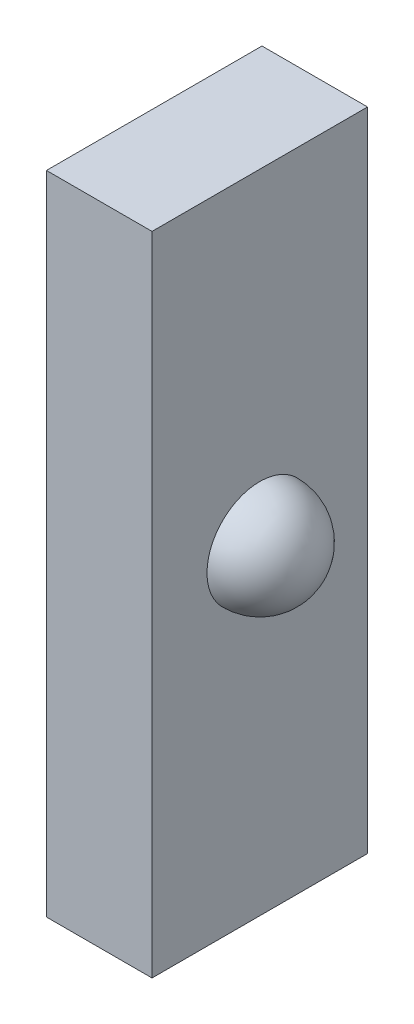
ISO-10303-21;
HEADER;
FILE_DESCRIPTION(('STEP AP214'),'2;1');
FILE_NAME('part.step','',(''),(''),'','','');
FILE_SCHEMA(('AUTOMOTIVE_DESIGN { 1 0 10303 214 1 1 1 1 }'));
ENDSEC;
DATA;
#1=APPLICATION_CONTEXT('core data for automotive mechanical design processes');
#2=APPLICATION_PROTOCOL_DEFINITION('international standard','automotive_design',2000,#1);
#3=PRODUCT_CONTEXT('',#1,'mechanical');
#4=PRODUCT('Part','Part','',(#3));
#5=PRODUCT_RELATED_PRODUCT_CATEGORY('part','',(#4));
#6=PRODUCT_DEFINITION_FORMATION('','',#4);
#7=PRODUCT_DEFINITION_CONTEXT('part definition',#1,'design');
#8=PRODUCT_DEFINITION('design','',#6,#7);
#9=PRODUCT_DEFINITION_SHAPE('','',#8);
#10=(LENGTH_UNIT() NAMED_UNIT(*) SI_UNIT(.MILLI.,.METRE.));
#11=(NAMED_UNIT(*) PLANE_ANGLE_UNIT() SI_UNIT($,.RADIAN.));
#12=(NAMED_UNIT(*) SI_UNIT($,.STERADIAN.) SOLID_ANGLE_UNIT());
#13=UNCERTAINTY_MEASURE_WITH_UNIT(LENGTH_MEASURE(1.E-05),#10,'distance_accuracy_value','');
#14=(GEOMETRIC_REPRESENTATION_CONTEXT(3) GLOBAL_UNCERTAINTY_ASSIGNED_CONTEXT((#13)) GLOBAL_UNIT_ASSIGNED_CONTEXT((#10,
#11,#12)) REPRESENTATION_CONTEXT('',''));
#15=CARTESIAN_POINT('',(0.,0.,0.));
#16=DIRECTION('',(0.,0.,1.));
#17=DIRECTION('',(1.,0.,0.));
#18=AXIS2_PLACEMENT_3D('',#15,#16,#17);
#19=CARTESIAN_POINT('',(0.,0.,0.));
#20=DIRECTION('',(0.,1.,0.));
#21=DIRECTION('',(0.,0.,1.));
#22=AXIS2_PLACEMENT_3D('',#19,#20,#21);
#23=SPHERICAL_SURFACE('',#22,4.9);
#24=CARTESIAN_POINT('',(0.,0.,0.));
#25=DIRECTION('',(-1.,0.,0.));
#26=DIRECTION('',(0.,0.,1.));
#27=AXIS2_PLACEMENT_3D('',#24,#25,#26);
#28=SPHERICAL_SURFACE('',#27,4.9);
#29=CARTESIAN_POINT('',(0.,0.,0.));
#30=DIRECTION('',(-1.,0.,0.));
#31=DIRECTION('',(0.,0.,1.));
#32=AXIS2_PLACEMENT_3D('',#29,#30,#31);
#33=CIRCLE('',#32,4.9);
#34=CARTESIAN_POINT('',(0.,0.,4.9));
#35=VERTEX_POINT('',#34);
#36=EDGE_CURVE('E11',#35,#35,#33,.T.);
#37=ORIENTED_EDGE('',*,*,#36,.F.);
#38=EDGE_LOOP('',(#37));
#39=FACE_BOUND('',#38,.T.);
#40=ADVANCED_FACE('F45',(#39),#28,.T.);
#41=CARTESIAN_POINT('',(-9.79688528222315,30.,-10.));
#42=DIRECTION('',(-1.,0.,0.));
#43=DIRECTION('',(0.,-1.,0.));
#44=AXIS2_PLACEMENT_3D('',#41,#42,#43);
#45=PLANE('',#44);
#46=CARTESIAN_POINT('',(-9.79688528222315,0.,0.));
#47=DIRECTION('',(-1.,0.,0.));
#48=DIRECTION('',(0.,-1.,0.));
#49=AXIS2_PLACEMENT_3D('',#46,#47,#48);
#50=CIRCLE('',#49,9.2);
#51=CARTESIAN_POINT('',(-9.79688528222315,9.2,0.));
#52=VERTEX_POINT('',#51);
#53=CARTESIAN_POINT('',(-9.79688528222315,-9.2,0.));
#54=VERTEX_POINT('',#53);
#55=EDGE_CURVE('E65',#52,#54,#50,.T.);
#56=ORIENTED_EDGE('',*,*,#55,.F.);
#57=CARTESIAN_POINT('',(-9.79688528222315,18.4,0.));
#58=DIRECTION('',(-1.,0.,0.));
#59=DIRECTION('',(0.,-1.,0.));
#60=AXIS2_PLACEMENT_3D('',#57,#58,#59);
#61=CIRCLE('',#60,9.2);
#62=EDGE_CURVE('E48',#52,#52,#61,.T.);
#63=ORIENTED_EDGE('',*,*,#62,.F.);
#64=EDGE_CURVE('E121',#54,#52,#50,.T.);
#65=ORIENTED_EDGE('',*,*,#64,.F.);
#66=CARTESIAN_POINT('',(-9.79688528222315,-18.4,0.));
#67=DIRECTION('',(-1.,0.,0.));
#68=DIRECTION('',(0.,-1.,0.));
#69=AXIS2_PLACEMENT_3D('',#66,#67,#68);
#70=CIRCLE('',#69,9.2);
#71=EDGE_CURVE('E148',#54,#54,#70,.T.);
#72=ORIENTED_EDGE('',*,*,#71,.F.);
#73=EDGE_LOOP('',(#56,#63,#65,#72));
#74=FACE_BOUND('',#73,.T.);
#75=DIRECTION('',(0.,0.,1.));
#76=VECTOR('',#75,1.);
#77=CARTESIAN_POINT('',(-9.79688528222315,-30.,-10.));
#78=LINE('',#77,#76);
#79=CARTESIAN_POINT('',(-9.79688528222315,-30.,-10.));
#80=VERTEX_POINT('',#79);
#81=CARTESIAN_POINT('',(-9.79688528222315,-30.,10.));
#82=VERTEX_POINT('',#81);
#83=EDGE_CURVE('E93',#80,#82,#78,.T.);
#84=ORIENTED_EDGE('',*,*,#83,.T.);
#85=DIRECTION('',(0.,-1.,0.));
#86=VECTOR('',#85,1.);
#87=CARTESIAN_POINT('',(-9.79688528222315,30.,10.));
#88=LINE('',#87,#86);
#89=CARTESIAN_POINT('',(-9.79688528222315,30.,10.));
#90=VERTEX_POINT('',#89);
#91=EDGE_CURVE('E97',#90,#82,#88,.T.);
#92=ORIENTED_EDGE('',*,*,#91,.F.);
#93=DIRECTION('',(0.,0.,1.));
#94=VECTOR('',#93,1.);
#95=CARTESIAN_POINT('',(-9.79688528222315,30.,-10.));
#96=LINE('',#95,#94);
#97=CARTESIAN_POINT('',(-9.79688528222315,30.,-10.));
#98=VERTEX_POINT('',#97);
#99=EDGE_CURVE('E54',#98,#90,#96,.T.);
#100=ORIENTED_EDGE('',*,*,#99,.F.);
#101=DIRECTION('',(0.,-1.,0.));
#102=VECTOR('',#101,1.);
#103=CARTESIAN_POINT('',(-9.79688528222315,30.,-10.));
#104=LINE('',#103,#102);
#105=EDGE_CURVE('E99',#98,#80,#104,.T.);
#106=ORIENTED_EDGE('',*,*,#105,.T.);
#107=EDGE_LOOP('',(#84,#92,#100,#106));
#108=FACE_BOUND('',#107,.T.);
#109=ADVANCED_FACE('F95',(#74,#108),#45,.T.);
#110=CARTESIAN_POINT('',(-9.79688528222315,30.,-10.));
#111=DIRECTION('',(0.,1.,0.));
#112=DIRECTION('',(0.,0.,1.));
#113=AXIS2_PLACEMENT_3D('',#110,#111,#112);
#114=PLANE('',#113);
#115=ORIENTED_EDGE('',*,*,#99,.T.);
#116=DIRECTION('',(-1.,0.,0.));
#117=VECTOR('',#116,1.);
#118=CARTESIAN_POINT('',(-9.79688528222315,30.,10.));
#119=LINE('',#118,#117);
#120=CARTESIAN_POINT('',(0.,30.,10.));
#121=VERTEX_POINT('',#120);
#122=EDGE_CURVE('E119',#121,#90,#119,.T.);
#123=ORIENTED_EDGE('',*,*,#122,.F.);
#124=DIRECTION('',(0.,0.,1.));
#125=VECTOR('',#124,1.);
#126=CARTESIAN_POINT('',(0.,30.,-10.));
#127=LINE('',#126,#125);
#128=CARTESIAN_POINT('',(0.,30.,-10.));
#129=VERTEX_POINT('',#128);
#130=EDGE_CURVE('E144',#129,#121,#127,.T.);
#131=ORIENTED_EDGE('',*,*,#130,.F.);
#132=DIRECTION('',(-1.,0.,0.));
#133=VECTOR('',#132,1.);
#134=CARTESIAN_POINT('',(-9.79688528222315,30.,-10.));
#135=LINE('',#134,#133);
#136=EDGE_CURVE('E105',#129,#98,#135,.T.);
#137=ORIENTED_EDGE('',*,*,#136,.T.);
#138=EDGE_LOOP('',(#115,#123,#131,#137));
#139=FACE_BOUND('',#138,.T.);
#140=ADVANCED_FACE('F174',(#139),#114,.T.);
#141=CARTESIAN_POINT('',(0.,30.,-10.));
#142=DIRECTION('',(1.,0.,0.));
#143=DIRECTION('',(0.,1.,0.));
#144=AXIS2_PLACEMENT_3D('',#141,#142,#143);
#145=PLANE('',#144);
#146=ORIENTED_EDGE('',*,*,#36,.T.);
#147=EDGE_LOOP('',(#146));
#148=FACE_BOUND('',#147,.T.);
#149=ORIENTED_EDGE('',*,*,#130,.T.);
#150=DIRECTION('',(0.,1.,0.));
#151=VECTOR('',#150,1.);
#152=CARTESIAN_POINT('',(0.,30.,10.));
#153=LINE('',#152,#151);
#154=CARTESIAN_POINT('',(0.,-30.,10.));
#155=VERTEX_POINT('',#154);
#156=EDGE_CURVE('E114',#155,#121,#153,.T.);
#157=ORIENTED_EDGE('',*,*,#156,.F.);
#158=DIRECTION('',(0.,0.,1.));
#159=VECTOR('',#158,1.);
#160=CARTESIAN_POINT('',(0.,-30.,-10.));
#161=LINE('',#160,#159);
#162=CARTESIAN_POINT('',(0.,-30.,-10.));
#163=VERTEX_POINT('',#162);
#164=EDGE_CURVE('E104',#163,#155,#161,.T.);
#165=ORIENTED_EDGE('',*,*,#164,.F.);
#166=DIRECTION('',(0.,1.,0.));
#167=VECTOR('',#166,1.);
#168=CARTESIAN_POINT('',(0.,30.,-10.));
#169=LINE('',#168,#167);
#170=EDGE_CURVE('E135',#163,#129,#169,.T.);
#171=ORIENTED_EDGE('',*,*,#170,.T.);
#172=EDGE_LOOP('',(#149,#157,#165,#171));
#173=FACE_BOUND('',#172,.T.);
#174=ADVANCED_FACE('F177',(#148,#173),#145,.T.);
#175=CARTESIAN_POINT('',(-9.79688528222315,-30.,-10.));
#176=DIRECTION('',(0.,-1.,0.));
#177=DIRECTION('',(0.,0.,-1.));
#178=AXIS2_PLACEMENT_3D('',#175,#176,#177);
#179=PLANE('',#178);
#180=ORIENTED_EDGE('',*,*,#164,.T.);
#181=DIRECTION('',(1.,0.,0.));
#182=VECTOR('',#181,1.);
#183=CARTESIAN_POINT('',(-9.79688528222315,-30.,10.));
#184=LINE('',#183,#182);
#185=EDGE_CURVE('E108',#82,#155,#184,.T.);
#186=ORIENTED_EDGE('',*,*,#185,.F.);
#187=ORIENTED_EDGE('',*,*,#83,.F.);
#188=DIRECTION('',(1.,0.,0.));
#189=VECTOR('',#188,1.);
#190=CARTESIAN_POINT('',(-9.79688528222315,-30.,-10.));
#191=LINE('',#190,#189);
#192=EDGE_CURVE('E132',#80,#163,#191,.T.);
#193=ORIENTED_EDGE('',*,*,#192,.T.);
#194=EDGE_LOOP('',(#180,#186,#187,#193));
#195=FACE_BOUND('',#194,.T.);
#196=ADVANCED_FACE('F109',(#195),#179,.T.);
#197=CARTESIAN_POINT('',(0.,0.,-10.));
#198=DIRECTION('',(0.,0.,1.));
#199=DIRECTION('',(1.,0.,0.));
#200=AXIS2_PLACEMENT_3D('',#197,#198,#199);
#201=PLANE('',#200);
#202=ORIENTED_EDGE('',*,*,#105,.F.);
#203=ORIENTED_EDGE('',*,*,#136,.F.);
#204=ORIENTED_EDGE('',*,*,#170,.F.);
#205=ORIENTED_EDGE('',*,*,#192,.F.);
#206=EDGE_LOOP('',(#202,#203,#204,#205));
#207=FACE_BOUND('',#206,.T.);
#208=ADVANCED_FACE('F167',(#207),#201,.F.);
#209=CARTESIAN_POINT('',(0.,0.,10.));
#210=DIRECTION('',(0.,0.,1.));
#211=DIRECTION('',(1.,0.,0.));
#212=AXIS2_PLACEMENT_3D('',#209,#210,#211);
#213=PLANE('',#212);
#214=ORIENTED_EDGE('',*,*,#91,.T.);
#215=ORIENTED_EDGE('',*,*,#185,.T.);
#216=ORIENTED_EDGE('',*,*,#156,.T.);
#217=ORIENTED_EDGE('',*,*,#122,.T.);
#218=EDGE_LOOP('',(#214,#215,#216,#217));
#219=FACE_BOUND('',#218,.T.);
#220=ADVANCED_FACE('F117',(#219),#213,.T.);
#221=CARTESIAN_POINT('',(-9.79688528222315,0.,0.));
#222=DIRECTION('',(0.,1.,0.));
#223=DIRECTION('',(1.,0.,0.));
#224=AXIS2_PLACEMENT_3D('',#221,#222,#223);
#225=SPHERICAL_SURFACE('',#224,9.2);
#226=CARTESIAN_POINT('',(-9.79688528222315,0.,0.));
#227=DIRECTION('',(-1.,0.,0.));
#228=DIRECTION('',(0.,-1.,0.));
#229=AXIS2_PLACEMENT_3D('',#226,#227,#228);
#230=SPHERICAL_SURFACE('',#229,9.2);
#231=ORIENTED_EDGE('',*,*,#64,.T.);
#232=ORIENTED_EDGE('',*,*,#55,.T.);
#233=EDGE_LOOP('',(#231,#232));
#234=FACE_BOUND('',#233,.T.);
#235=ADVANCED_FACE('F157',(#234),#230,.F.);
#236=CARTESIAN_POINT('',(-9.79688528222315,-18.4,0.));
#237=DIRECTION('',(0.,1.,0.));
#238=DIRECTION('',(1.,0.,0.));
#239=AXIS2_PLACEMENT_3D('',#236,#237,#238);
#240=SPHERICAL_SURFACE('',#239,9.2);
#241=CARTESIAN_POINT('',(-9.79688528222315,-18.4,0.));
#242=DIRECTION('',(-1.,0.,0.));
#243=DIRECTION('',(0.,-1.,0.));
#244=AXIS2_PLACEMENT_3D('',#241,#242,#243);
#245=SPHERICAL_SURFACE('',#244,9.2);
#246=ORIENTED_EDGE('',*,*,#71,.T.);
#247=EDGE_LOOP('',(#246));
#248=FACE_BOUND('',#247,.T.);
#249=ADVANCED_FACE('F154',(#248),#245,.F.);
#250=CARTESIAN_POINT('',(-9.79688528222315,18.4,0.));
#251=DIRECTION('',(0.,1.,0.));
#252=DIRECTION('',(1.,0.,0.));
#253=AXIS2_PLACEMENT_3D('',#250,#251,#252);
#254=SPHERICAL_SURFACE('',#253,9.2);
#255=CARTESIAN_POINT('',(-9.79688528222315,18.4,0.));
#256=DIRECTION('',(-1.,0.,0.));
#257=DIRECTION('',(0.,-1.,0.));
#258=AXIS2_PLACEMENT_3D('',#255,#256,#257);
#259=SPHERICAL_SURFACE('',#258,9.2);
#260=ORIENTED_EDGE('',*,*,#62,.T.);
#261=EDGE_LOOP('',(#260));
#262=FACE_BOUND('',#261,.T.);
#263=ADVANCED_FACE('F164',(#262),#259,.F.);
#264=CLOSED_SHELL('',(#40,#109,#140,#174,#196,#208,#220,#235,#249,#263));
#265=MANIFOLD_SOLID_BREP('B2',#264);
#266=ADVANCED_BREP_SHAPE_REPRESENTATION('',(#18,#265),#14);
#267=SHAPE_DEFINITION_REPRESENTATION(#9,#266);
ENDSEC;
END-ISO-10303-21;
